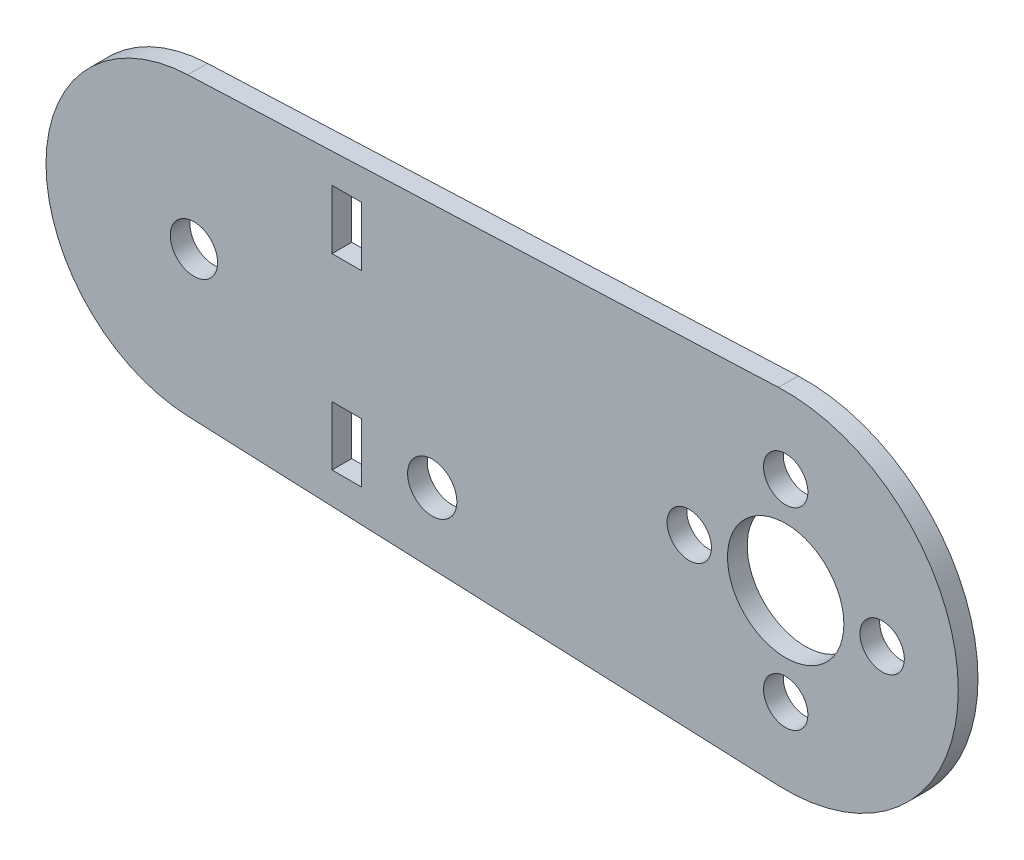
ISO-10303-21;
HEADER;
FILE_DESCRIPTION(('STEP AP214'),'2;1');
FILE_NAME('part.step','',(''),(''),'','','');
FILE_SCHEMA(('AUTOMOTIVE_DESIGN { 1 0 10303 214 1 1 1 1 }'));
ENDSEC;
DATA;
#1=APPLICATION_CONTEXT('core data for automotive mechanical design processes');
#2=APPLICATION_PROTOCOL_DEFINITION('international standard','automotive_design',2000,#1);
#3=PRODUCT_CONTEXT('',#1,'mechanical');
#4=PRODUCT('Part','Part','',(#3));
#5=PRODUCT_RELATED_PRODUCT_CATEGORY('part','',(#4));
#6=PRODUCT_DEFINITION_FORMATION('','',#4);
#7=PRODUCT_DEFINITION_CONTEXT('part definition',#1,'design');
#8=PRODUCT_DEFINITION('design','',#6,#7);
#9=PRODUCT_DEFINITION_SHAPE('','',#8);
#10=(LENGTH_UNIT() NAMED_UNIT(*) SI_UNIT(.MILLI.,.METRE.));
#11=(NAMED_UNIT(*) PLANE_ANGLE_UNIT() SI_UNIT($,.RADIAN.));
#12=(NAMED_UNIT(*) SI_UNIT($,.STERADIAN.) SOLID_ANGLE_UNIT());
#13=UNCERTAINTY_MEASURE_WITH_UNIT(LENGTH_MEASURE(1.E-05),#10,'distance_accuracy_value','');
#14=(GEOMETRIC_REPRESENTATION_CONTEXT(3) GLOBAL_UNCERTAINTY_ASSIGNED_CONTEXT((#13)) GLOBAL_UNIT_ASSIGNED_CONTEXT((#10,
#11,#12)) REPRESENTATION_CONTEXT('',''));
#15=CARTESIAN_POINT('',(0.,0.,0.));
#16=DIRECTION('',(0.,0.,1.));
#17=DIRECTION('',(1.,0.,0.));
#18=AXIS2_PLACEMENT_3D('',#15,#16,#17);
#19=CARTESIAN_POINT('',(0.,0.,2.));
#20=DIRECTION('',(0.,0.,1.));
#21=DIRECTION('',(1.,0.,0.));
#22=AXIS2_PLACEMENT_3D('',#19,#20,#21);
#23=PLANE('',#22);
#24=CARTESIAN_POINT('',(-35.8403472689703,-8.87522290561815,2.));
#25=DIRECTION('',(0.,0.,1.));
#26=DIRECTION('',(1.,0.,0.));
#27=AXIS2_PLACEMENT_3D('',#24,#25,#26);
#28=CIRCLE('',#27,2.5);
#29=CARTESIAN_POINT('',(-33.3403472689703,-8.87522290561815,2.));
#30=VERTEX_POINT('',#29);
#31=EDGE_CURVE('E262',#30,#30,#28,.T.);
#32=ORIENTED_EDGE('',*,*,#31,.F.);
#33=EDGE_LOOP('',(#32));
#34=FACE_BOUND('',#33,.T.);
#35=DIRECTION('',(0.,-1.,0.));
#36=VECTOR('',#35,1.);
#37=CARTESIAN_POINT('',(-46.0000000000004,0.,2.));
#38=LINE('',#37,#36);
#39=CARTESIAN_POINT('',(-46.0000000000004,12.5942706090473,2.));
#40=VERTEX_POINT('',#39);
#41=CARTESIAN_POINT('',(-46.0000000000004,6.5942706090473,2.));
#42=VERTEX_POINT('',#41);
#43=EDGE_CURVE('E53',#40,#42,#38,.T.);
#44=ORIENTED_EDGE('',*,*,#43,.F.);
#45=DIRECTION('',(1.,0.,0.));
#46=VECTOR('',#45,1.);
#47=CARTESIAN_POINT('',(0.,12.5942706090473,2.));
#48=LINE('',#47,#46);
#49=CARTESIAN_POINT('',(-43.0000000000004,12.5942706090473,2.));
#50=VERTEX_POINT('',#49);
#51=EDGE_CURVE('E145',#40,#50,#48,.T.);
#52=ORIENTED_EDGE('',*,*,#51,.T.);
#53=DIRECTION('',(0.,-1.,0.));
#54=VECTOR('',#53,1.);
#55=CARTESIAN_POINT('',(-43.0000000000004,0.,2.));
#56=LINE('',#55,#54);
#57=CARTESIAN_POINT('',(-43.0000000000004,6.5942706090473,2.));
#58=VERTEX_POINT('',#57);
#59=EDGE_CURVE('E130',#50,#58,#56,.T.);
#60=ORIENTED_EDGE('',*,*,#59,.T.);
#61=DIRECTION('',(1.,0.,0.));
#62=VECTOR('',#61,1.);
#63=CARTESIAN_POINT('',(0.,6.5942706090473,2.));
#64=LINE('',#63,#62);
#65=EDGE_CURVE('E139',#42,#58,#64,.T.);
#66=ORIENTED_EDGE('',*,*,#65,.F.);
#67=EDGE_LOOP('',(#44,#52,#60,#66));
#68=FACE_BOUND('',#67,.T.);
#69=CARTESIAN_POINT('',(0.,0.,2.));
#70=DIRECTION('',(0.,0.,1.));
#71=DIRECTION('',(1.,0.,0.));
#72=AXIS2_PLACEMENT_3D('',#69,#70,#71);
#73=CIRCLE('',#72,17.5);
#74=CARTESIAN_POINT('',(-0.729166666666667,-17.4848024287443,2.));
#75=VERTEX_POINT('',#74);
#76=CARTESIAN_POINT('',(-0.729166666666666,17.4848024287443,2.));
#77=VERTEX_POINT('',#76);
#78=EDGE_CURVE('E209',#75,#77,#73,.T.);
#79=ORIENTED_EDGE('',*,*,#78,.T.);
#80=DIRECTION('',(0.999131567356817,0.0416666666666667,0.));
#81=VECTOR('',#80,1.);
#82=CARTESIAN_POINT('',(-0.729166666666667,17.4848024287443,2.));
#83=LINE('',#82,#81);
#84=CARTESIAN_POINT('',(-60.625,14.9869735103523,2.));
#85=VERTEX_POINT('',#84);
#86=EDGE_CURVE('E212',#85,#77,#83,.T.);
#87=ORIENTED_EDGE('',*,*,#86,.F.);
#88=CARTESIAN_POINT('',(-60.,0.,2.));
#89=DIRECTION('',(0.,0.,1.));
#90=DIRECTION('',(1.,0.,0.));
#91=AXIS2_PLACEMENT_3D('',#88,#89,#90);
#92=CIRCLE('',#91,15.);
#93=CARTESIAN_POINT('',(-60.625,-14.9869735103522,2.));
#94=VERTEX_POINT('',#93);
#95=EDGE_CURVE('E215',#85,#94,#92,.T.);
#96=ORIENTED_EDGE('',*,*,#95,.T.);
#97=DIRECTION('',(0.999131567356817,-0.0416666666666667,0.));
#98=VECTOR('',#97,1.);
#99=CARTESIAN_POINT('',(-0.729166666666667,-17.4848024287443,2.));
#100=LINE('',#99,#98);
#101=EDGE_CURVE('E217',#94,#75,#100,.T.);
#102=ORIENTED_EDGE('',*,*,#101,.T.);
#103=EDGE_LOOP('',(#79,#87,#96,#102));
#104=FACE_BOUND('',#103,.T.);
#105=CARTESIAN_POINT('',(0.,0.,2.));
#106=DIRECTION('',(0.,0.,1.));
#107=DIRECTION('',(1.,0.,0.));
#108=AXIS2_PLACEMENT_3D('',#105,#106,#107);
#109=CIRCLE('',#108,5.9);
#110=CARTESIAN_POINT('',(5.9,0.,2.));
#111=VERTEX_POINT('',#110);
#112=EDGE_CURVE('E206',#111,#111,#109,.T.);
#113=ORIENTED_EDGE('',*,*,#112,.F.);
#114=EDGE_LOOP('',(#113));
#115=FACE_BOUND('',#114,.T.);
#116=CARTESIAN_POINT('',(0.,9.78,2.));
#117=DIRECTION('',(0.,0.,1.));
#118=DIRECTION('',(1.,0.,0.));
#119=AXIS2_PLACEMENT_3D('',#116,#117,#118);
#120=CIRCLE('',#119,2.25);
#121=CARTESIAN_POINT('',(2.25,9.78,2.));
#122=VERTEX_POINT('',#121);
#123=EDGE_CURVE('E197',#122,#122,#120,.T.);
#124=ORIENTED_EDGE('',*,*,#123,.F.);
#125=EDGE_LOOP('',(#124));
#126=FACE_BOUND('',#125,.T.);
#127=CARTESIAN_POINT('',(-9.77999999999904,-9.56896067183362E-13,2.));
#128=DIRECTION('',(0.,0.,1.));
#129=DIRECTION('',(1.,0.,0.));
#130=AXIS2_PLACEMENT_3D('',#127,#128,#129);
#131=CIRCLE('',#130,2.25);
#132=CARTESIAN_POINT('',(-7.52999999999904,-9.56896067183362E-13,2.));
#133=VERTEX_POINT('',#132);
#134=EDGE_CURVE('E191',#133,#133,#131,.T.);
#135=ORIENTED_EDGE('',*,*,#134,.F.);
#136=EDGE_LOOP('',(#135));
#137=FACE_BOUND('',#136,.T.);
#138=CARTESIAN_POINT('',(9.78000000000095,9.55698362613796E-13,2.));
#139=DIRECTION('',(0.,0.,1.));
#140=DIRECTION('',(1.,0.,0.));
#141=AXIS2_PLACEMENT_3D('',#138,#139,#140);
#142=CIRCLE('',#141,2.25);
#143=CARTESIAN_POINT('',(12.030000000001,9.55698362613796E-13,2.));
#144=VERTEX_POINT('',#143);
#145=EDGE_CURVE('E185',#144,#144,#142,.T.);
#146=ORIENTED_EDGE('',*,*,#145,.F.);
#147=EDGE_LOOP('',(#146));
#148=FACE_BOUND('',#147,.T.);
#149=CARTESIAN_POINT('',(1.91139672522759E-12,-9.78,2.));
#150=DIRECTION('',(0.,0.,1.));
#151=DIRECTION('',(1.,0.,0.));
#152=AXIS2_PLACEMENT_3D('',#149,#150,#151);
#153=CIRCLE('',#152,2.25);
#154=CARTESIAN_POINT('',(2.25000000000191,-9.78,2.));
#155=VERTEX_POINT('',#154);
#156=EDGE_CURVE('E179',#155,#155,#153,.T.);
#157=ORIENTED_EDGE('',*,*,#156,.F.);
#158=EDGE_LOOP('',(#157));
#159=FACE_BOUND('',#158,.T.);
#160=CARTESIAN_POINT('',(-60.,0.,2.));
#161=DIRECTION('',(0.,0.,1.));
#162=DIRECTION('',(1.,0.,0.));
#163=AXIS2_PLACEMENT_3D('',#160,#161,#162);
#164=CIRCLE('',#163,2.4);
#165=CARTESIAN_POINT('',(-57.6,0.,2.));
#166=VERTEX_POINT('',#165);
#167=EDGE_CURVE('E169',#166,#166,#164,.T.);
#168=ORIENTED_EDGE('',*,*,#167,.F.);
#169=EDGE_LOOP('',(#168));
#170=FACE_BOUND('',#169,.T.);
#171=DIRECTION('',(0.,-1.,0.));
#172=VECTOR('',#171,1.);
#173=CARTESIAN_POINT('',(-46.0000000000004,0.,2.));
#174=LINE('',#173,#172);
#175=CARTESIAN_POINT('',(-46.0000000000004,-6.4057293909527,2.));
#176=VERTEX_POINT('',#175);
#177=CARTESIAN_POINT('',(-46.0000000000004,-12.4057293909527,2.));
#178=VERTEX_POINT('',#177);
#179=EDGE_CURVE('E157',#176,#178,#174,.T.);
#180=ORIENTED_EDGE('',*,*,#179,.F.);
#181=DIRECTION('',(1.,0.,0.));
#182=VECTOR('',#181,1.);
#183=CARTESIAN_POINT('',(0.,-6.4057293909527,2.));
#184=LINE('',#183,#182);
#185=CARTESIAN_POINT('',(-43.0000000000004,-6.4057293909527,2.));
#186=VERTEX_POINT('',#185);
#187=EDGE_CURVE('E152',#176,#186,#184,.T.);
#188=ORIENTED_EDGE('',*,*,#187,.T.);
#189=DIRECTION('',(0.,-1.,0.));
#190=VECTOR('',#189,1.);
#191=CARTESIAN_POINT('',(-43.0000000000004,0.,2.));
#192=LINE('',#191,#190);
#193=CARTESIAN_POINT('',(-43.0000000000004,-12.4057293909527,2.));
#194=VERTEX_POINT('',#193);
#195=EDGE_CURVE('E163',#186,#194,#192,.T.);
#196=ORIENTED_EDGE('',*,*,#195,.T.);
#197=DIRECTION('',(1.,0.,0.));
#198=VECTOR('',#197,1.);
#199=CARTESIAN_POINT('',(0.,-12.4057293909527,2.));
#200=LINE('',#199,#198);
#201=EDGE_CURVE('E160',#178,#194,#200,.T.);
#202=ORIENTED_EDGE('',*,*,#201,.F.);
#203=EDGE_LOOP('',(#180,#188,#196,#202));
#204=FACE_BOUND('',#203,.T.);
#205=ADVANCED_FACE('F38',(#34,#68,#104,#115,#126,#137,#148,#159,#170,#204),#23,.T.);
#206=CARTESIAN_POINT('',(0.,0.,0.));
#207=DIRECTION('',(0.,0.,1.));
#208=DIRECTION('',(1.,0.,0.));
#209=AXIS2_PLACEMENT_3D('',#206,#207,#208);
#210=PLANE('',#209);
#211=CARTESIAN_POINT('',(-35.8403472689703,-8.87522290561815,0.));
#212=DIRECTION('',(0.,0.,1.));
#213=DIRECTION('',(1.,0.,0.));
#214=AXIS2_PLACEMENT_3D('',#211,#212,#213);
#215=CIRCLE('',#214,2.5);
#216=CARTESIAN_POINT('',(-33.3403472689703,-8.87522290561815,0.));
#217=VERTEX_POINT('',#216);
#218=EDGE_CURVE('E260',#217,#217,#215,.T.);
#219=ORIENTED_EDGE('',*,*,#218,.T.);
#220=EDGE_LOOP('',(#219));
#221=FACE_BOUND('',#220,.T.);
#222=DIRECTION('',(1.,0.,0.));
#223=VECTOR('',#222,1.);
#224=CARTESIAN_POINT('',(0.,12.5942706090473,0.));
#225=LINE('',#224,#223);
#226=CARTESIAN_POINT('',(-46.0000000000004,12.5942706090473,0.));
#227=VERTEX_POINT('',#226);
#228=CARTESIAN_POINT('',(-43.0000000000004,12.5942706090473,0.));
#229=VERTEX_POINT('',#228);
#230=EDGE_CURVE('E46',#227,#229,#225,.T.);
#231=ORIENTED_EDGE('',*,*,#230,.F.);
#232=DIRECTION('',(0.,-1.,0.));
#233=VECTOR('',#232,1.);
#234=CARTESIAN_POINT('',(-46.0000000000004,0.,0.));
#235=LINE('',#234,#233);
#236=CARTESIAN_POINT('',(-46.0000000000004,6.5942706090473,0.));
#237=VERTEX_POINT('',#236);
#238=EDGE_CURVE('E11',#227,#237,#235,.T.);
#239=ORIENTED_EDGE('',*,*,#238,.T.);
#240=DIRECTION('',(1.,0.,0.));
#241=VECTOR('',#240,1.);
#242=CARTESIAN_POINT('',(0.,6.5942706090473,0.));
#243=LINE('',#242,#241);
#244=CARTESIAN_POINT('',(-43.0000000000004,6.5942706090473,0.));
#245=VERTEX_POINT('',#244);
#246=EDGE_CURVE('E250',#237,#245,#243,.T.);
#247=ORIENTED_EDGE('',*,*,#246,.T.);
#248=DIRECTION('',(0.,-1.,0.));
#249=VECTOR('',#248,1.);
#250=CARTESIAN_POINT('',(-43.0000000000004,0.,0.));
#251=LINE('',#250,#249);
#252=EDGE_CURVE('E133',#229,#245,#251,.T.);
#253=ORIENTED_EDGE('',*,*,#252,.F.);
#254=EDGE_LOOP('',(#231,#239,#247,#253));
#255=FACE_BOUND('',#254,.T.);
#256=CARTESIAN_POINT('',(0.,0.,0.));
#257=DIRECTION('',(0.,0.,1.));
#258=DIRECTION('',(1.,0.,0.));
#259=AXIS2_PLACEMENT_3D('',#256,#257,#258);
#260=CIRCLE('',#259,17.5);
#261=CARTESIAN_POINT('',(-0.729166666666667,-17.4848024287443,0.));
#262=VERTEX_POINT('',#261);
#263=CARTESIAN_POINT('',(-0.729166666666666,17.4848024287443,0.));
#264=VERTEX_POINT('',#263);
#265=EDGE_CURVE('E222',#262,#264,#260,.T.);
#266=ORIENTED_EDGE('',*,*,#265,.F.);
#267=DIRECTION('',(0.999131567356817,-0.0416666666666667,0.));
#268=VECTOR('',#267,1.);
#269=CARTESIAN_POINT('',(-0.729166666666667,-17.4848024287443,0.));
#270=LINE('',#269,#268);
#271=CARTESIAN_POINT('',(-60.625,-14.9869735103522,0.));
#272=VERTEX_POINT('',#271);
#273=EDGE_CURVE('E210',#272,#262,#270,.T.);
#274=ORIENTED_EDGE('',*,*,#273,.F.);
#275=CARTESIAN_POINT('',(-60.,0.,0.));
#276=DIRECTION('',(0.,0.,1.));
#277=DIRECTION('',(1.,0.,0.));
#278=AXIS2_PLACEMENT_3D('',#275,#276,#277);
#279=CIRCLE('',#278,15.);
#280=CARTESIAN_POINT('',(-60.625,14.9869735103523,0.));
#281=VERTEX_POINT('',#280);
#282=EDGE_CURVE('E228',#281,#272,#279,.T.);
#283=ORIENTED_EDGE('',*,*,#282,.F.);
#284=DIRECTION('',(0.999131567356817,0.0416666666666667,0.));
#285=VECTOR('',#284,1.);
#286=CARTESIAN_POINT('',(-0.729166666666667,17.4848024287443,0.));
#287=LINE('',#286,#285);
#288=EDGE_CURVE('E225',#281,#264,#287,.T.);
#289=ORIENTED_EDGE('',*,*,#288,.T.);
#290=EDGE_LOOP('',(#266,#274,#283,#289));
#291=FACE_BOUND('',#290,.T.);
#292=CARTESIAN_POINT('',(0.,0.,0.));
#293=DIRECTION('',(0.,0.,1.));
#294=DIRECTION('',(1.,0.,0.));
#295=AXIS2_PLACEMENT_3D('',#292,#293,#294);
#296=CIRCLE('',#295,5.9);
#297=CARTESIAN_POINT('',(5.9,0.,0.));
#298=VERTEX_POINT('',#297);
#299=EDGE_CURVE('E203',#298,#298,#296,.T.);
#300=ORIENTED_EDGE('',*,*,#299,.T.);
#301=EDGE_LOOP('',(#300));
#302=FACE_BOUND('',#301,.T.);
#303=CARTESIAN_POINT('',(0.,9.78,0.));
#304=DIRECTION('',(0.,0.,1.));
#305=DIRECTION('',(1.,0.,0.));
#306=AXIS2_PLACEMENT_3D('',#303,#304,#305);
#307=CIRCLE('',#306,2.25);
#308=CARTESIAN_POINT('',(2.25,9.78,0.));
#309=VERTEX_POINT('',#308);
#310=EDGE_CURVE('E200',#309,#309,#307,.T.);
#311=ORIENTED_EDGE('',*,*,#310,.T.);
#312=EDGE_LOOP('',(#311));
#313=FACE_BOUND('',#312,.T.);
#314=CARTESIAN_POINT('',(-9.77999999999904,-9.56896067183362E-13,0.));
#315=DIRECTION('',(0.,0.,1.));
#316=DIRECTION('',(1.,0.,0.));
#317=AXIS2_PLACEMENT_3D('',#314,#315,#316);
#318=CIRCLE('',#317,2.25);
#319=CARTESIAN_POINT('',(-7.52999999999904,-9.56896067183362E-13,0.));
#320=VERTEX_POINT('',#319);
#321=EDGE_CURVE('E194',#320,#320,#318,.T.);
#322=ORIENTED_EDGE('',*,*,#321,.T.);
#323=EDGE_LOOP('',(#322));
#324=FACE_BOUND('',#323,.T.);
#325=CARTESIAN_POINT('',(9.78000000000095,9.55698362613796E-13,0.));
#326=DIRECTION('',(0.,0.,1.));
#327=DIRECTION('',(1.,0.,0.));
#328=AXIS2_PLACEMENT_3D('',#325,#326,#327);
#329=CIRCLE('',#328,2.25);
#330=CARTESIAN_POINT('',(12.030000000001,9.55698362613796E-13,0.));
#331=VERTEX_POINT('',#330);
#332=EDGE_CURVE('E188',#331,#331,#329,.T.);
#333=ORIENTED_EDGE('',*,*,#332,.T.);
#334=EDGE_LOOP('',(#333));
#335=FACE_BOUND('',#334,.T.);
#336=CARTESIAN_POINT('',(1.91139672522759E-12,-9.78,0.));
#337=DIRECTION('',(0.,0.,1.));
#338=DIRECTION('',(1.,0.,0.));
#339=AXIS2_PLACEMENT_3D('',#336,#337,#338);
#340=CIRCLE('',#339,2.25);
#341=CARTESIAN_POINT('',(2.25000000000191,-9.78,0.));
#342=VERTEX_POINT('',#341);
#343=EDGE_CURVE('E182',#342,#342,#340,.T.);
#344=ORIENTED_EDGE('',*,*,#343,.T.);
#345=EDGE_LOOP('',(#344));
#346=FACE_BOUND('',#345,.T.);
#347=CARTESIAN_POINT('',(-60.,0.,0.));
#348=DIRECTION('',(0.,0.,1.));
#349=DIRECTION('',(1.,0.,0.));
#350=AXIS2_PLACEMENT_3D('',#347,#348,#349);
#351=CIRCLE('',#350,2.4);
#352=CARTESIAN_POINT('',(-57.6,0.,0.));
#353=VERTEX_POINT('',#352);
#354=EDGE_CURVE('E176',#353,#353,#351,.T.);
#355=ORIENTED_EDGE('',*,*,#354,.T.);
#356=EDGE_LOOP('',(#355));
#357=FACE_BOUND('',#356,.T.);
#358=DIRECTION('',(1.,0.,0.));
#359=VECTOR('',#358,1.);
#360=CARTESIAN_POINT('',(0.,-6.4057293909527,0.));
#361=LINE('',#360,#359);
#362=CARTESIAN_POINT('',(-46.0000000000004,-6.4057293909527,0.));
#363=VERTEX_POINT('',#362);
#364=CARTESIAN_POINT('',(-43.0000000000004,-6.4057293909527,0.));
#365=VERTEX_POINT('',#364);
#366=EDGE_CURVE('E248',#363,#365,#361,.T.);
#367=ORIENTED_EDGE('',*,*,#366,.F.);
#368=DIRECTION('',(0.,-1.,0.));
#369=VECTOR('',#368,1.);
#370=CARTESIAN_POINT('',(-46.0000000000004,0.,0.));
#371=LINE('',#370,#369);
#372=CARTESIAN_POINT('',(-46.0000000000004,-12.4057293909527,0.));
#373=VERTEX_POINT('',#372);
#374=EDGE_CURVE('E240',#363,#373,#371,.T.);
#375=ORIENTED_EDGE('',*,*,#374,.T.);
#376=DIRECTION('',(1.,0.,0.));
#377=VECTOR('',#376,1.);
#378=CARTESIAN_POINT('',(0.,-12.4057293909527,0.));
#379=LINE('',#378,#377);
#380=CARTESIAN_POINT('',(-43.0000000000004,-12.4057293909527,0.));
#381=VERTEX_POINT('',#380);
#382=EDGE_CURVE('E243',#373,#381,#379,.T.);
#383=ORIENTED_EDGE('',*,*,#382,.T.);
#384=DIRECTION('',(0.,-1.,0.));
#385=VECTOR('',#384,1.);
#386=CARTESIAN_POINT('',(-43.0000000000004,0.,0.));
#387=LINE('',#386,#385);
#388=EDGE_CURVE('E246',#365,#381,#387,.T.);
#389=ORIENTED_EDGE('',*,*,#388,.F.);
#390=EDGE_LOOP('',(#367,#375,#383,#389));
#391=FACE_BOUND('',#390,.T.);
#392=ADVANCED_FACE('F257',(#221,#255,#291,#302,#313,#324,#335,#346,#357,#391),#210,.F.);
#393=CARTESIAN_POINT('',(0.,0.,2.));
#394=DIRECTION('',(0.,0.,-1.));
#395=DIRECTION('',(-1.,0.,0.));
#396=AXIS2_PLACEMENT_3D('',#393,#394,#395);
#397=CYLINDRICAL_SURFACE('',#396,17.5);
#398=ORIENTED_EDGE('',*,*,#265,.T.);
#399=DIRECTION('',(0.,0.,-1.));
#400=VECTOR('',#399,1.);
#401=CARTESIAN_POINT('',(-0.729166666666666,17.4848024287443,2.));
#402=LINE('',#401,#400);
#403=EDGE_CURVE('E238',#77,#264,#402,.T.);
#404=ORIENTED_EDGE('',*,*,#403,.F.);
#405=ORIENTED_EDGE('',*,*,#78,.F.);
#406=DIRECTION('',(0.,0.,-1.));
#407=VECTOR('',#406,1.);
#408=CARTESIAN_POINT('',(-0.729166666666667,-17.4848024287443,2.));
#409=LINE('',#408,#407);
#410=EDGE_CURVE('E219',#75,#262,#409,.T.);
#411=ORIENTED_EDGE('',*,*,#410,.T.);
#412=EDGE_LOOP('',(#398,#404,#405,#411));
#413=FACE_BOUND('',#412,.T.);
#414=ADVANCED_FACE('F275',(#413),#397,.T.);
#415=CARTESIAN_POINT('',(-0.729166666666667,17.4848024287443,2.));
#416=DIRECTION('',(-0.0416666666666667,0.999131567356817,0.));
#417=DIRECTION('',(-0.999131567356817,-0.0416666666666667,0.));
#418=AXIS2_PLACEMENT_3D('',#415,#416,#417);
#419=PLANE('',#418);
#420=ORIENTED_EDGE('',*,*,#288,.F.);
#421=DIRECTION('',(0.,0.,-1.));
#422=VECTOR('',#421,1.);
#423=CARTESIAN_POINT('',(-60.625,14.9869735103523,2.));
#424=LINE('',#423,#422);
#425=EDGE_CURVE('E236',#85,#281,#424,.T.);
#426=ORIENTED_EDGE('',*,*,#425,.F.);
#427=ORIENTED_EDGE('',*,*,#86,.T.);
#428=ORIENTED_EDGE('',*,*,#403,.T.);
#429=EDGE_LOOP('',(#420,#426,#427,#428));
#430=FACE_BOUND('',#429,.T.);
#431=ADVANCED_FACE('F289',(#430),#419,.T.);
#432=CARTESIAN_POINT('',(-60.,0.,2.));
#433=DIRECTION('',(0.,0.,-1.));
#434=DIRECTION('',(-1.,0.,0.));
#435=AXIS2_PLACEMENT_3D('',#432,#433,#434);
#436=CYLINDRICAL_SURFACE('',#435,15.);
#437=ORIENTED_EDGE('',*,*,#282,.T.);
#438=DIRECTION('',(0.,0.,-1.));
#439=VECTOR('',#438,1.);
#440=CARTESIAN_POINT('',(-60.625,-14.9869735103522,2.));
#441=LINE('',#440,#439);
#442=EDGE_CURVE('E233',#94,#272,#441,.T.);
#443=ORIENTED_EDGE('',*,*,#442,.F.);
#444=ORIENTED_EDGE('',*,*,#95,.F.);
#445=ORIENTED_EDGE('',*,*,#425,.T.);
#446=EDGE_LOOP('',(#437,#443,#444,#445));
#447=FACE_BOUND('',#446,.T.);
#448=ADVANCED_FACE('F286',(#447),#436,.T.);
#449=CARTESIAN_POINT('',(0.,0.,2.));
#450=DIRECTION('',(0.,0.,-1.));
#451=DIRECTION('',(-1.,0.,0.));
#452=AXIS2_PLACEMENT_3D('',#449,#450,#451);
#453=CYLINDRICAL_SURFACE('',#452,5.9);
#454=ORIENTED_EDGE('',*,*,#112,.T.);
#455=EDGE_LOOP('',(#454));
#456=FACE_BOUND('',#455,.T.);
#457=ORIENTED_EDGE('',*,*,#299,.F.);
#458=EDGE_LOOP('',(#457));
#459=FACE_BOUND('',#458,.T.);
#460=ADVANCED_FACE('F40',(#456,#459),#453,.F.);
#461=CARTESIAN_POINT('',(-0.729166666666667,-17.4848024287443,2.));
#462=DIRECTION('',(0.0416666666666667,0.999131567356817,0.));
#463=DIRECTION('',(-0.999131567356817,0.0416666666666667,0.));
#464=AXIS2_PLACEMENT_3D('',#461,#462,#463);
#465=PLANE('',#464);
#466=ORIENTED_EDGE('',*,*,#273,.T.);
#467=ORIENTED_EDGE('',*,*,#410,.F.);
#468=ORIENTED_EDGE('',*,*,#101,.F.);
#469=ORIENTED_EDGE('',*,*,#442,.T.);
#470=EDGE_LOOP('',(#466,#467,#468,#469));
#471=FACE_BOUND('',#470,.T.);
#472=ADVANCED_FACE('F282',(#471),#465,.F.);
#473=CARTESIAN_POINT('',(0.,9.78,0.));
#474=DIRECTION('',(0.,0.,1.));
#475=DIRECTION('',(1.,0.,0.));
#476=AXIS2_PLACEMENT_3D('',#473,#474,#475);
#477=CYLINDRICAL_SURFACE('',#476,2.25);
#478=ORIENTED_EDGE('',*,*,#310,.F.);
#479=EDGE_LOOP('',(#478));
#480=FACE_BOUND('',#479,.T.);
#481=ORIENTED_EDGE('',*,*,#123,.T.);
#482=EDGE_LOOP('',(#481));
#483=FACE_BOUND('',#482,.T.);
#484=ADVANCED_FACE('F279',(#480,#483),#477,.F.);
#485=CARTESIAN_POINT('',(-9.77999999999904,-9.56896067183362E-13,0.));
#486=DIRECTION('',(0.,0.,1.));
#487=DIRECTION('',(1.,0.,0.));
#488=AXIS2_PLACEMENT_3D('',#485,#486,#487);
#489=CYLINDRICAL_SURFACE('',#488,2.25);
#490=ORIENTED_EDGE('',*,*,#321,.F.);
#491=EDGE_LOOP('',(#490));
#492=FACE_BOUND('',#491,.T.);
#493=ORIENTED_EDGE('',*,*,#134,.T.);
#494=EDGE_LOOP('',(#493));
#495=FACE_BOUND('',#494,.T.);
#496=ADVANCED_FACE('F362',(#492,#495),#489,.F.);
#497=CARTESIAN_POINT('',(9.78000000000095,9.55698362613796E-13,0.));
#498=DIRECTION('',(0.,0.,1.));
#499=DIRECTION('',(1.,0.,0.));
#500=AXIS2_PLACEMENT_3D('',#497,#498,#499);
#501=CYLINDRICAL_SURFACE('',#500,2.25);
#502=ORIENTED_EDGE('',*,*,#332,.F.);
#503=EDGE_LOOP('',(#502));
#504=FACE_BOUND('',#503,.T.);
#505=ORIENTED_EDGE('',*,*,#145,.T.);
#506=EDGE_LOOP('',(#505));
#507=FACE_BOUND('',#506,.T.);
#508=ADVANCED_FACE('F359',(#504,#507),#501,.F.);
#509=CARTESIAN_POINT('',(1.91139672522759E-12,-9.78,0.));
#510=DIRECTION('',(0.,0.,1.));
#511=DIRECTION('',(1.,0.,0.));
#512=AXIS2_PLACEMENT_3D('',#509,#510,#511);
#513=CYLINDRICAL_SURFACE('',#512,2.25);
#514=ORIENTED_EDGE('',*,*,#343,.F.);
#515=EDGE_LOOP('',(#514));
#516=FACE_BOUND('',#515,.T.);
#517=ORIENTED_EDGE('',*,*,#156,.T.);
#518=EDGE_LOOP('',(#517));
#519=FACE_BOUND('',#518,.T.);
#520=ADVANCED_FACE('F355',(#516,#519),#513,.F.);
#521=CARTESIAN_POINT('',(-60.,0.,0.));
#522=DIRECTION('',(0.,0.,1.));
#523=DIRECTION('',(1.,0.,0.));
#524=AXIS2_PLACEMENT_3D('',#521,#522,#523);
#525=CYLINDRICAL_SURFACE('',#524,2.4);
#526=ORIENTED_EDGE('',*,*,#354,.F.);
#527=EDGE_LOOP('',(#526));
#528=FACE_BOUND('',#527,.T.);
#529=ORIENTED_EDGE('',*,*,#167,.T.);
#530=EDGE_LOOP('',(#529));
#531=FACE_BOUND('',#530,.T.);
#532=ADVANCED_FACE('F352',(#528,#531),#525,.F.);
#533=CARTESIAN_POINT('',(0.,-6.4057293909527,-8.));
#534=DIRECTION('',(0.,-1.,0.));
#535=DIRECTION('',(0.,0.,-1.));
#536=AXIS2_PLACEMENT_3D('',#533,#534,#535);
#537=PLANE('',#536);
#538=ORIENTED_EDGE('',*,*,#366,.T.);
#539=DIRECTION('',(0.,0.,1.));
#540=VECTOR('',#539,1.);
#541=CARTESIAN_POINT('',(-43.0000000000004,-6.4057293909527,-8.));
#542=LINE('',#541,#540);
#543=EDGE_CURVE('E167',#365,#186,#542,.T.);
#544=ORIENTED_EDGE('',*,*,#543,.T.);
#545=ORIENTED_EDGE('',*,*,#187,.F.);
#546=DIRECTION('',(0.,0.,1.));
#547=VECTOR('',#546,1.);
#548=CARTESIAN_POINT('',(-46.0000000000004,-6.4057293909527,-8.));
#549=LINE('',#548,#547);
#550=EDGE_CURVE('E166',#363,#176,#549,.T.);
#551=ORIENTED_EDGE('',*,*,#550,.F.);
#552=EDGE_LOOP('',(#538,#544,#545,#551));
#553=FACE_BOUND('',#552,.T.);
#554=ADVANCED_FACE('F330',(#553),#537,.T.);
#555=CARTESIAN_POINT('',(-43.0000000000004,0.,-8.));
#556=DIRECTION('',(-1.,0.,0.));
#557=DIRECTION('',(0.,0.,1.));
#558=AXIS2_PLACEMENT_3D('',#555,#556,#557);
#559=PLANE('',#558);
#560=ORIENTED_EDGE('',*,*,#388,.T.);
#561=DIRECTION('',(0.,0.,1.));
#562=VECTOR('',#561,1.);
#563=CARTESIAN_POINT('',(-43.0000000000004,-12.4057293909527,-8.));
#564=LINE('',#563,#562);
#565=EDGE_CURVE('E170',#381,#194,#564,.T.);
#566=ORIENTED_EDGE('',*,*,#565,.T.);
#567=ORIENTED_EDGE('',*,*,#195,.F.);
#568=ORIENTED_EDGE('',*,*,#543,.F.);
#569=EDGE_LOOP('',(#560,#566,#567,#568));
#570=FACE_BOUND('',#569,.T.);
#571=ADVANCED_FACE('F336',(#570),#559,.T.);
#572=CARTESIAN_POINT('',(0.,-12.4057293909527,-8.));
#573=DIRECTION('',(0.,-1.,0.));
#574=DIRECTION('',(0.,0.,-1.));
#575=AXIS2_PLACEMENT_3D('',#572,#573,#574);
#576=PLANE('',#575);
#577=DIRECTION('',(0.,0.,1.));
#578=VECTOR('',#577,1.);
#579=CARTESIAN_POINT('',(-46.0000000000004,-12.4057293909527,-8.));
#580=LINE('',#579,#578);
#581=EDGE_CURVE('E172',#373,#178,#580,.T.);
#582=ORIENTED_EDGE('',*,*,#581,.T.);
#583=ORIENTED_EDGE('',*,*,#201,.T.);
#584=ORIENTED_EDGE('',*,*,#565,.F.);
#585=ORIENTED_EDGE('',*,*,#382,.F.);
#586=EDGE_LOOP('',(#582,#583,#584,#585));
#587=FACE_BOUND('',#586,.T.);
#588=ADVANCED_FACE('F339',(#587),#576,.F.);
#589=CARTESIAN_POINT('',(-46.0000000000004,0.,-8.));
#590=DIRECTION('',(-1.,0.,0.));
#591=DIRECTION('',(0.,-1.,0.));
#592=AXIS2_PLACEMENT_3D('',#589,#590,#591);
#593=PLANE('',#592);
#594=ORIENTED_EDGE('',*,*,#550,.T.);
#595=ORIENTED_EDGE('',*,*,#179,.T.);
#596=ORIENTED_EDGE('',*,*,#581,.F.);
#597=ORIENTED_EDGE('',*,*,#374,.F.);
#598=EDGE_LOOP('',(#594,#595,#596,#597));
#599=FACE_BOUND('',#598,.T.);
#600=ADVANCED_FACE('F325',(#599),#593,.F.);
#601=CARTESIAN_POINT('',(-46.0000000000004,0.,-8.));
#602=DIRECTION('',(-1.,0.,0.));
#603=DIRECTION('',(0.,-1.,0.));
#604=AXIS2_PLACEMENT_3D('',#601,#602,#603);
#605=PLANE('',#604);
#606=DIRECTION('',(0.,0.,1.));
#607=VECTOR('',#606,1.);
#608=CARTESIAN_POINT('',(-46.0000000000004,12.5942706090473,-8.));
#609=LINE('',#608,#607);
#610=EDGE_CURVE('E150',#227,#40,#609,.T.);
#611=ORIENTED_EDGE('',*,*,#610,.T.);
#612=ORIENTED_EDGE('',*,*,#43,.T.);
#613=DIRECTION('',(0.,0.,1.));
#614=VECTOR('',#613,1.);
#615=CARTESIAN_POINT('',(-46.0000000000004,6.5942706090473,-8.));
#616=LINE('',#615,#614);
#617=EDGE_CURVE('E136',#237,#42,#616,.T.);
#618=ORIENTED_EDGE('',*,*,#617,.F.);
#619=ORIENTED_EDGE('',*,*,#238,.F.);
#620=EDGE_LOOP('',(#611,#612,#618,#619));
#621=FACE_BOUND('',#620,.T.);
#622=ADVANCED_FACE('F259',(#621),#605,.F.);
#623=CARTESIAN_POINT('',(0.,12.5942706090473,-8.));
#624=DIRECTION('',(0.,-1.,0.));
#625=DIRECTION('',(0.,0.,-1.));
#626=AXIS2_PLACEMENT_3D('',#623,#624,#625);
#627=PLANE('',#626);
#628=ORIENTED_EDGE('',*,*,#230,.T.);
#629=DIRECTION('',(0.,0.,1.));
#630=VECTOR('',#629,1.);
#631=CARTESIAN_POINT('',(-43.0000000000004,12.5942706090473,-8.));
#632=LINE('',#631,#630);
#633=EDGE_CURVE('E135',#229,#50,#632,.T.);
#634=ORIENTED_EDGE('',*,*,#633,.T.);
#635=ORIENTED_EDGE('',*,*,#51,.F.);
#636=ORIENTED_EDGE('',*,*,#610,.F.);
#637=EDGE_LOOP('',(#628,#634,#635,#636));
#638=FACE_BOUND('',#637,.T.);
#639=ADVANCED_FACE('F255',(#638),#627,.T.);
#640=CARTESIAN_POINT('',(-43.0000000000004,0.,-8.));
#641=DIRECTION('',(-1.,0.,0.));
#642=DIRECTION('',(0.,0.,1.));
#643=AXIS2_PLACEMENT_3D('',#640,#641,#642);
#644=PLANE('',#643);
#645=ORIENTED_EDGE('',*,*,#252,.T.);
#646=DIRECTION('',(0.,0.,1.));
#647=VECTOR('',#646,1.);
#648=CARTESIAN_POINT('',(-43.0000000000004,6.5942706090473,-8.));
#649=LINE('',#648,#647);
#650=EDGE_CURVE('E61',#245,#58,#649,.T.);
#651=ORIENTED_EDGE('',*,*,#650,.T.);
#652=ORIENTED_EDGE('',*,*,#59,.F.);
#653=ORIENTED_EDGE('',*,*,#633,.F.);
#654=EDGE_LOOP('',(#645,#651,#652,#653));
#655=FACE_BOUND('',#654,.T.);
#656=ADVANCED_FACE('F127',(#655),#644,.T.);
#657=CARTESIAN_POINT('',(0.,6.5942706090473,-8.));
#658=DIRECTION('',(0.,-1.,0.));
#659=DIRECTION('',(0.,0.,-1.));
#660=AXIS2_PLACEMENT_3D('',#657,#658,#659);
#661=PLANE('',#660);
#662=ORIENTED_EDGE('',*,*,#617,.T.);
#663=ORIENTED_EDGE('',*,*,#65,.T.);
#664=ORIENTED_EDGE('',*,*,#650,.F.);
#665=ORIENTED_EDGE('',*,*,#246,.F.);
#666=EDGE_LOOP('',(#662,#663,#664,#665));
#667=FACE_BOUND('',#666,.T.);
#668=ADVANCED_FACE('F140',(#667),#661,.F.);
#669=CARTESIAN_POINT('',(-35.8403472689703,-8.87522290561815,0.));
#670=DIRECTION('',(0.,0.,1.));
#671=DIRECTION('',(1.,0.,0.));
#672=AXIS2_PLACEMENT_3D('',#669,#670,#671);
#673=CYLINDRICAL_SURFACE('',#672,2.5);
#674=ORIENTED_EDGE('',*,*,#218,.F.);
#675=EDGE_LOOP('',(#674));
#676=FACE_BOUND('',#675,.T.);
#677=ORIENTED_EDGE('',*,*,#31,.T.);
#678=EDGE_LOOP('',(#677));
#679=FACE_BOUND('',#678,.T.);
#680=ADVANCED_FACE('F268',(#676,#679),#673,.F.);
#681=CLOSED_SHELL('',(#205,#392,#414,#431,#448,#460,#472,#484,#496,#508,#520,#532,#554,#571,
#588,#600,#622,#639,#656,#668,#680));
#682=MANIFOLD_SOLID_BREP('B2',#681);
#683=ADVANCED_BREP_SHAPE_REPRESENTATION('',(#18,#682),#14);
#684=SHAPE_DEFINITION_REPRESENTATION(#9,#683);
ENDSEC;
END-ISO-10303-21;
